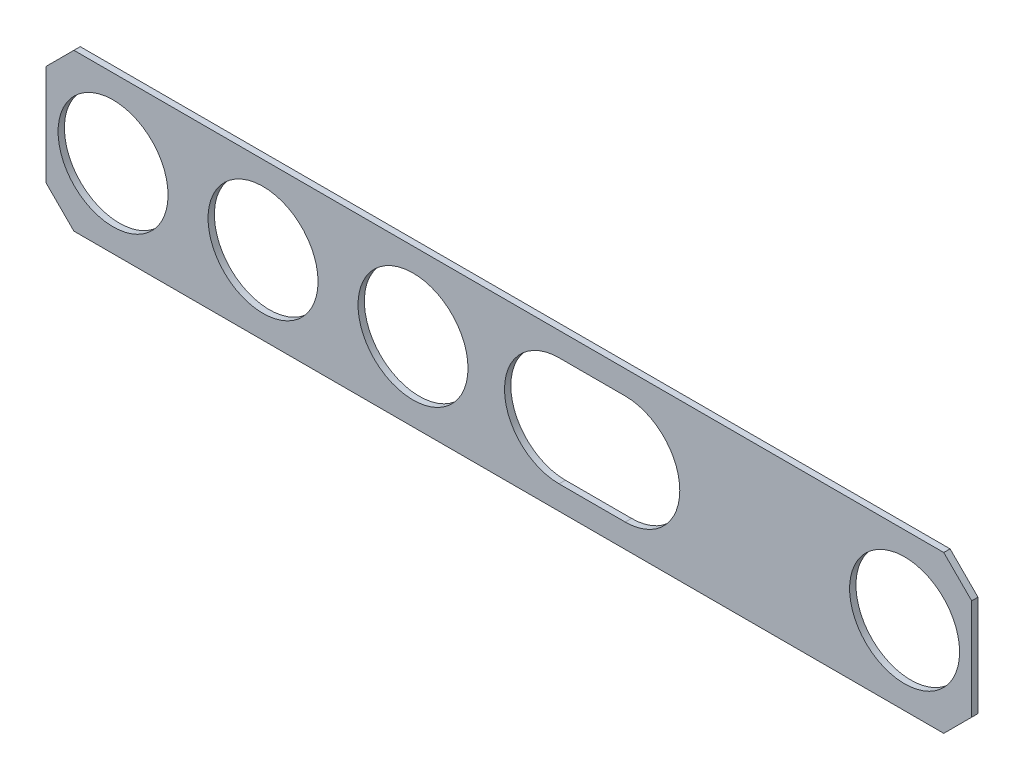
ISO-10303-21;
HEADER;
FILE_DESCRIPTION(('STEP AP214'),'2;1');
FILE_NAME('part.step','',(''),(''),'','','');
FILE_SCHEMA(('AUTOMOTIVE_DESIGN { 1 0 10303 214 1 1 1 1 }'));
ENDSEC;
DATA;
#1=APPLICATION_CONTEXT('core data for automotive mechanical design processes');
#2=APPLICATION_PROTOCOL_DEFINITION('international standard','automotive_design',2000,#1);
#3=PRODUCT_CONTEXT('',#1,'mechanical');
#4=PRODUCT('Part','Part','',(#3));
#5=PRODUCT_RELATED_PRODUCT_CATEGORY('part','',(#4));
#6=PRODUCT_DEFINITION_FORMATION('','',#4);
#7=PRODUCT_DEFINITION_CONTEXT('part definition',#1,'design');
#8=PRODUCT_DEFINITION('design','',#6,#7);
#9=PRODUCT_DEFINITION_SHAPE('','',#8);
#10=(LENGTH_UNIT() NAMED_UNIT(*) SI_UNIT(.MILLI.,.METRE.));
#11=(NAMED_UNIT(*) PLANE_ANGLE_UNIT() SI_UNIT($,.RADIAN.));
#12=(NAMED_UNIT(*) SI_UNIT($,.STERADIAN.) SOLID_ANGLE_UNIT());
#13=UNCERTAINTY_MEASURE_WITH_UNIT(LENGTH_MEASURE(1.E-05),#10,'distance_accuracy_value','');
#14=(GEOMETRIC_REPRESENTATION_CONTEXT(3) GLOBAL_UNCERTAINTY_ASSIGNED_CONTEXT((#13)) GLOBAL_UNIT_ASSIGNED_CONTEXT((#10,
#11,#12)) REPRESENTATION_CONTEXT('',''));
#15=CARTESIAN_POINT('',(0.,0.,0.));
#16=DIRECTION('',(0.,0.,1.));
#17=DIRECTION('',(1.,0.,0.));
#18=AXIS2_PLACEMENT_3D('',#15,#16,#17);
#19=CARTESIAN_POINT('',(0.,0.,-1.835));
#20=DIRECTION('',(0.,0.,1.));
#21=DIRECTION('',(1.,0.,0.));
#22=AXIS2_PLACEMENT_3D('',#19,#20,#21);
#23=PLANE('',#22);
#24=CARTESIAN_POINT('',(13.96785551477,0.,-1.835));
#25=DIRECTION('',(0.,0.,1.));
#26=DIRECTION('',(1.,0.,0.));
#27=AXIS2_PLACEMENT_3D('',#24,#25,#26);
#28=CIRCLE('',#27,6.55);
#29=CARTESIAN_POINT('',(13.96785551477,6.55,-1.835));
#30=VERTEX_POINT('',#29);
#31=CARTESIAN_POINT('',(13.96785551477,-6.55,-1.835));
#32=VERTEX_POINT('',#31);
#33=EDGE_CURVE('E118',#30,#32,#28,.F.);
#34=ORIENTED_EDGE('',*,*,#33,.T.);
#35=DIRECTION('',(1.,0.,0.));
#36=VECTOR('',#35,1.);
#37=CARTESIAN_POINT('',(13.96785551477,-6.55,-1.835));
#38=LINE('',#37,#36);
#39=CARTESIAN_POINT('',(6.032144485231,-6.55,-1.835));
#40=VERTEX_POINT('',#39);
#41=EDGE_CURVE('E120',#40,#32,#38,.T.);
#42=ORIENTED_EDGE('',*,*,#41,.F.);
#43=CARTESIAN_POINT('',(6.032144485231,0.,-1.835));
#44=DIRECTION('',(0.,0.,1.));
#45=DIRECTION('',(1.,0.,0.));
#46=AXIS2_PLACEMENT_3D('',#43,#44,#45);
#47=CIRCLE('',#46,6.55);
#48=CARTESIAN_POINT('',(6.032144485231,6.55,-1.835));
#49=VERTEX_POINT('',#48);
#50=EDGE_CURVE('E56',#40,#49,#47,.F.);
#51=ORIENTED_EDGE('',*,*,#50,.T.);
#52=DIRECTION('',(1.,0.,0.));
#53=VECTOR('',#52,1.);
#54=CARTESIAN_POINT('',(6.032144485231,6.55,-1.835));
#55=LINE('',#54,#53);
#56=EDGE_CURVE('E116',#30,#49,#55,.F.);
#57=ORIENTED_EDGE('',*,*,#56,.F.);
#58=EDGE_LOOP('',(#34,#42,#51,#57));
#59=FACE_BOUND('',#58,.T.);
#60=CARTESIAN_POINT('',(47.5,0.,-1.835));
#61=DIRECTION('',(0.,0.,1.));
#62=DIRECTION('',(1.,0.,0.));
#63=AXIS2_PLACEMENT_3D('',#60,#61,#62);
#64=CIRCLE('',#63,6.6);
#65=CARTESIAN_POINT('',(54.1,0.,-1.835));
#66=VERTEX_POINT('',#65);
#67=EDGE_CURVE('E121',#66,#66,#64,.F.);
#68=ORIENTED_EDGE('',*,*,#67,.T.);
#69=EDGE_LOOP('',(#68));
#70=FACE_BOUND('',#69,.T.);
#71=CARTESIAN_POINT('',(-47.5,0.,-1.835));
#72=DIRECTION('',(0.,0.,1.));
#73=DIRECTION('',(1.,0.,0.));
#74=AXIS2_PLACEMENT_3D('',#71,#72,#73);
#75=CIRCLE('',#74,6.6);
#76=CARTESIAN_POINT('',(-40.9,0.,-1.835));
#77=VERTEX_POINT('',#76);
#78=EDGE_CURVE('E146',#77,#77,#75,.F.);
#79=ORIENTED_EDGE('',*,*,#78,.T.);
#80=EDGE_LOOP('',(#79));
#81=FACE_BOUND('',#80,.T.);
#82=CARTESIAN_POINT('',(-29.5,0.,-1.835));
#83=DIRECTION('',(0.,0.,1.));
#84=DIRECTION('',(1.,0.,0.));
#85=AXIS2_PLACEMENT_3D('',#82,#83,#84);
#86=CIRCLE('',#85,6.6);
#87=CARTESIAN_POINT('',(-22.9,0.,-1.835));
#88=VERTEX_POINT('',#87);
#89=EDGE_CURVE('E148',#88,#88,#86,.F.);
#90=ORIENTED_EDGE('',*,*,#89,.T.);
#91=EDGE_LOOP('',(#90));
#92=FACE_BOUND('',#91,.T.);
#93=CARTESIAN_POINT('',(-11.5,0.,-1.835));
#94=DIRECTION('',(0.,0.,1.));
#95=DIRECTION('',(1.,0.,0.));
#96=AXIS2_PLACEMENT_3D('',#93,#94,#95);
#97=CIRCLE('',#96,6.6);
#98=CARTESIAN_POINT('',(-4.9,0.,-1.835));
#99=VERTEX_POINT('',#98);
#100=EDGE_CURVE('E20',#99,#99,#97,.F.);
#101=ORIENTED_EDGE('',*,*,#100,.T.);
#102=EDGE_LOOP('',(#101));
#103=FACE_BOUND('',#102,.T.);
#104=DIRECTION('',(0.,1.,0.));
#105=VECTOR('',#104,1.);
#106=CARTESIAN_POINT('',(55.55,-6.050050506339,-1.835));
#107=LINE('',#106,#105);
#108=CARTESIAN_POINT('',(55.55,6.050050506339,-1.835));
#109=VERTEX_POINT('',#108);
#110=CARTESIAN_POINT('',(55.55,-6.05005050634,-1.835));
#111=VERTEX_POINT('',#110);
#112=EDGE_CURVE('E97',#109,#111,#107,.F.);
#113=ORIENTED_EDGE('',*,*,#112,.F.);
#114=DIRECTION('',(-0.707106781186548,0.707106781186548,0.));
#115=VECTOR('',#114,1.);
#116=CARTESIAN_POINT('',(55.55,6.050050506339,-1.835));
#117=LINE('',#116,#115);
#118=CARTESIAN_POINT('',(52.2000505063397,9.39999999999975,-1.835));
#119=VERTEX_POINT('',#118);
#120=EDGE_CURVE('E68',#119,#109,#117,.F.);
#121=ORIENTED_EDGE('',*,*,#120,.F.);
#122=DIRECTION('',(1.,0.,0.));
#123=VECTOR('',#122,1.);
#124=CARTESIAN_POINT('',(52.20005050634,9.4,-1.835));
#125=LINE('',#124,#123);
#126=CARTESIAN_POINT('',(-52.20005050634,9.4,-1.835));
#127=VERTEX_POINT('',#126);
#128=EDGE_CURVE('E94',#127,#119,#125,.T.);
#129=ORIENTED_EDGE('',*,*,#128,.F.);
#130=DIRECTION('',(-0.707106781186548,-0.707106781186548,0.));
#131=VECTOR('',#130,1.);
#132=CARTESIAN_POINT('',(-52.20005050634,9.4,-1.835));
#133=LINE('',#132,#131);
#134=CARTESIAN_POINT('',(-55.55,6.05005050634,-1.835));
#135=VERTEX_POINT('',#134);
#136=EDGE_CURVE('E190',#135,#127,#133,.F.);
#137=ORIENTED_EDGE('',*,*,#136,.F.);
#138=DIRECTION('',(0.,1.,0.));
#139=VECTOR('',#138,1.);
#140=CARTESIAN_POINT('',(-55.55,6.050050506339,-1.835));
#141=LINE('',#140,#139);
#142=CARTESIAN_POINT('',(-55.55,-6.050050506339,-1.835));
#143=VERTEX_POINT('',#142);
#144=EDGE_CURVE('E184',#143,#135,#141,.T.);
#145=ORIENTED_EDGE('',*,*,#144,.F.);
#146=DIRECTION('',(0.707106781186548,-0.707106781186548,0.));
#147=VECTOR('',#146,1.);
#148=CARTESIAN_POINT('',(-55.55,-6.050050506339,-1.835));
#149=LINE('',#148,#147);
#150=CARTESIAN_POINT('',(-52.2000505063397,-9.39999999999975,-1.835));
#151=VERTEX_POINT('',#150);
#152=EDGE_CURVE('E178',#151,#143,#149,.F.);
#153=ORIENTED_EDGE('',*,*,#152,.F.);
#154=DIRECTION('',(1.,0.,0.));
#155=VECTOR('',#154,1.);
#156=CARTESIAN_POINT('',(-52.20005050634,-9.4,-1.835));
#157=LINE('',#156,#155);
#158=CARTESIAN_POINT('',(52.20005050634,-9.4,-1.835));
#159=VERTEX_POINT('',#158);
#160=EDGE_CURVE('E172',#159,#151,#157,.F.);
#161=ORIENTED_EDGE('',*,*,#160,.F.);
#162=DIRECTION('',(0.707106781186548,0.707106781186548,0.));
#163=VECTOR('',#162,1.);
#164=CARTESIAN_POINT('',(52.20005050634,-9.4,-1.835));
#165=LINE('',#164,#163);
#166=EDGE_CURVE('E166',#111,#159,#165,.F.);
#167=ORIENTED_EDGE('',*,*,#166,.F.);
#168=EDGE_LOOP('',(#113,#121,#129,#137,#145,#153,#161,#167));
#169=FACE_BOUND('',#168,.T.);
#170=ADVANCED_FACE('F17',(#59,#70,#81,#92,#103,#169),#23,.T.);
#171=CARTESIAN_POINT('',(55.55,6.050050506339,-1.835));
#172=DIRECTION('',(0.707106781186548,0.707106781186548,0.));
#173=DIRECTION('',(-0.707106781186548,0.707106781186548,0.));
#174=AXIS2_PLACEMENT_3D('',#171,#172,#173);
#175=PLANE('',#174);
#176=DIRECTION('',(0.,0.,1.));
#177=VECTOR('',#176,1.);
#178=CARTESIAN_POINT('',(52.20005050634,9.4,-1.835));
#179=LINE('',#178,#177);
#180=CARTESIAN_POINT('',(52.2000505063397,9.39999999999975,-2.595));
#181=VERTEX_POINT('',#180);
#182=EDGE_CURVE('E98',#119,#181,#179,.F.);
#183=ORIENTED_EDGE('',*,*,#182,.F.);
#184=ORIENTED_EDGE('',*,*,#120,.T.);
#185=DIRECTION('',(0.,0.,-1.));
#186=VECTOR('',#185,1.);
#187=CARTESIAN_POINT('',(55.55,6.050050506339,-1.835));
#188=LINE('',#187,#186);
#189=CARTESIAN_POINT('',(55.55,6.050050506339,-2.595));
#190=VERTEX_POINT('',#189);
#191=EDGE_CURVE('E155',#190,#109,#188,.F.);
#192=ORIENTED_EDGE('',*,*,#191,.F.);
#193=DIRECTION('',(-0.707106781186441,0.707106781186654,0.));
#194=VECTOR('',#193,1.);
#195=CARTESIAN_POINT('',(55.55,6.050050506339,-2.595));
#196=LINE('',#195,#194);
#197=EDGE_CURVE('E112',#190,#181,#196,.T.);
#198=ORIENTED_EDGE('',*,*,#197,.T.);
#199=EDGE_LOOP('',(#183,#184,#192,#198));
#200=FACE_BOUND('',#199,.T.);
#201=ADVANCED_FACE('F110',(#200),#175,.T.);
#202=CARTESIAN_POINT('',(52.20005050634,9.4,-1.835));
#203=DIRECTION('',(0.,1.,0.));
#204=DIRECTION('',(0.,0.,1.));
#205=AXIS2_PLACEMENT_3D('',#202,#203,#204);
#206=PLANE('',#205);
#207=DIRECTION('',(0.,0.,1.));
#208=VECTOR('',#207,1.);
#209=CARTESIAN_POINT('',(-52.20005050634,9.4,-1.835));
#210=LINE('',#209,#208);
#211=CARTESIAN_POINT('',(-52.20005050634,9.4,-2.595));
#212=VERTEX_POINT('',#211);
#213=EDGE_CURVE('E107',#127,#212,#210,.F.);
#214=ORIENTED_EDGE('',*,*,#213,.F.);
#215=ORIENTED_EDGE('',*,*,#128,.T.);
#216=ORIENTED_EDGE('',*,*,#182,.T.);
#217=DIRECTION('',(1.,0.,0.));
#218=VECTOR('',#217,1.);
#219=CARTESIAN_POINT('',(0.,9.4,-2.595));
#220=LINE('',#219,#218);
#221=EDGE_CURVE('E204',#181,#212,#220,.F.);
#222=ORIENTED_EDGE('',*,*,#221,.T.);
#223=EDGE_LOOP('',(#214,#215,#216,#222));
#224=FACE_BOUND('',#223,.T.);
#225=ADVANCED_FACE('F103',(#224),#206,.T.);
#226=CARTESIAN_POINT('',(-52.20005050634,9.4,-1.835));
#227=DIRECTION('',(-0.707106781186548,0.707106781186548,0.));
#228=DIRECTION('',(-0.707106781186548,-0.707106781186548,0.));
#229=AXIS2_PLACEMENT_3D('',#226,#227,#228);
#230=PLANE('',#229);
#231=DIRECTION('',(0.,0.,1.));
#232=VECTOR('',#231,1.);
#233=CARTESIAN_POINT('',(-55.55,6.05005050634,-1.835));
#234=LINE('',#233,#232);
#235=CARTESIAN_POINT('',(-55.55,6.05005050634,-2.595));
#236=VERTEX_POINT('',#235);
#237=EDGE_CURVE('E187',#135,#236,#234,.F.);
#238=ORIENTED_EDGE('',*,*,#237,.F.);
#239=ORIENTED_EDGE('',*,*,#136,.T.);
#240=ORIENTED_EDGE('',*,*,#213,.T.);
#241=DIRECTION('',(-0.707106781186547,-0.707106781186548,0.));
#242=VECTOR('',#241,1.);
#243=CARTESIAN_POINT('',(-52.20005050634,9.4,-2.595));
#244=LINE('',#243,#242);
#245=EDGE_CURVE('E198',#212,#236,#244,.T.);
#246=ORIENTED_EDGE('',*,*,#245,.T.);
#247=EDGE_LOOP('',(#238,#239,#240,#246));
#248=FACE_BOUND('',#247,.T.);
#249=ADVANCED_FACE('F196',(#248),#230,.T.);
#250=CARTESIAN_POINT('',(-55.55,6.050050506339,-1.835));
#251=DIRECTION('',(-1.,0.,0.));
#252=DIRECTION('',(0.,0.,1.));
#253=AXIS2_PLACEMENT_3D('',#250,#251,#252);
#254=PLANE('',#253);
#255=DIRECTION('',(0.,0.,1.));
#256=VECTOR('',#255,1.);
#257=CARTESIAN_POINT('',(-55.55,-6.050050506339,-1.835));
#258=LINE('',#257,#256);
#259=CARTESIAN_POINT('',(-55.55,-6.050050506339,-2.595));
#260=VERTEX_POINT('',#259);
#261=EDGE_CURVE('E181',#143,#260,#258,.F.);
#262=ORIENTED_EDGE('',*,*,#261,.F.);
#263=ORIENTED_EDGE('',*,*,#144,.T.);
#264=ORIENTED_EDGE('',*,*,#237,.T.);
#265=DIRECTION('',(0.,1.,0.));
#266=VECTOR('',#265,1.);
#267=CARTESIAN_POINT('',(-55.55,0.,-2.595));
#268=LINE('',#267,#266);
#269=EDGE_CURVE('E207',#236,#260,#268,.F.);
#270=ORIENTED_EDGE('',*,*,#269,.T.);
#271=EDGE_LOOP('',(#262,#263,#264,#270));
#272=FACE_BOUND('',#271,.T.);
#273=ADVANCED_FACE('F245',(#272),#254,.T.);
#274=CARTESIAN_POINT('',(-55.55,-6.050050506339,-1.835));
#275=DIRECTION('',(-0.707106781186548,-0.707106781186548,0.));
#276=DIRECTION('',(0.707106781186548,-0.707106781186548,0.));
#277=AXIS2_PLACEMENT_3D('',#274,#275,#276);
#278=PLANE('',#277);
#279=DIRECTION('',(0.,0.,-1.));
#280=VECTOR('',#279,1.);
#281=CARTESIAN_POINT('',(-52.20005050634,-9.4,-1.835));
#282=LINE('',#281,#280);
#283=CARTESIAN_POINT('',(-52.2000505063397,-9.39999999999975,-2.595));
#284=VERTEX_POINT('',#283);
#285=EDGE_CURVE('E175',#151,#284,#282,.T.);
#286=ORIENTED_EDGE('',*,*,#285,.F.);
#287=ORIENTED_EDGE('',*,*,#152,.T.);
#288=ORIENTED_EDGE('',*,*,#261,.T.);
#289=DIRECTION('',(0.707106781186441,-0.707106781186654,0.));
#290=VECTOR('',#289,1.);
#291=CARTESIAN_POINT('',(-55.55,-6.050050506339,-2.595));
#292=LINE('',#291,#290);
#293=EDGE_CURVE('E240',#260,#284,#292,.T.);
#294=ORIENTED_EDGE('',*,*,#293,.T.);
#295=EDGE_LOOP('',(#286,#287,#288,#294));
#296=FACE_BOUND('',#295,.T.);
#297=ADVANCED_FACE('F264',(#296),#278,.T.);
#298=CARTESIAN_POINT('',(-52.20005050634,-9.4,-1.835));
#299=DIRECTION('',(0.,-1.,0.));
#300=DIRECTION('',(0.,0.,-1.));
#301=AXIS2_PLACEMENT_3D('',#298,#299,#300);
#302=PLANE('',#301);
#303=DIRECTION('',(0.,0.,1.));
#304=VECTOR('',#303,1.);
#305=CARTESIAN_POINT('',(52.20005050634,-9.4,-1.835));
#306=LINE('',#305,#304);
#307=CARTESIAN_POINT('',(52.20005050634,-9.4,-2.595));
#308=VERTEX_POINT('',#307);
#309=EDGE_CURVE('E169',#159,#308,#306,.F.);
#310=ORIENTED_EDGE('',*,*,#309,.F.);
#311=ORIENTED_EDGE('',*,*,#160,.T.);
#312=ORIENTED_EDGE('',*,*,#285,.T.);
#313=DIRECTION('',(1.,0.,0.));
#314=VECTOR('',#313,1.);
#315=CARTESIAN_POINT('',(0.,-9.4,-2.595));
#316=LINE('',#315,#314);
#317=EDGE_CURVE('E237',#284,#308,#316,.T.);
#318=ORIENTED_EDGE('',*,*,#317,.T.);
#319=EDGE_LOOP('',(#310,#311,#312,#318));
#320=FACE_BOUND('',#319,.T.);
#321=ADVANCED_FACE('F262',(#320),#302,.T.);
#322=CARTESIAN_POINT('',(52.20005050634,-9.4,-1.835));
#323=DIRECTION('',(0.707106781186548,-0.707106781186548,0.));
#324=DIRECTION('',(0.707106781186548,0.707106781186548,0.));
#325=AXIS2_PLACEMENT_3D('',#322,#323,#324);
#326=PLANE('',#325);
#327=DIRECTION('',(0.,0.,-1.));
#328=VECTOR('',#327,1.);
#329=CARTESIAN_POINT('',(55.55,-6.05005050634,-1.835));
#330=LINE('',#329,#328);
#331=CARTESIAN_POINT('',(55.55,-6.05005050634,-2.595));
#332=VERTEX_POINT('',#331);
#333=EDGE_CURVE('E160',#111,#332,#330,.T.);
#334=ORIENTED_EDGE('',*,*,#333,.F.);
#335=ORIENTED_EDGE('',*,*,#166,.T.);
#336=ORIENTED_EDGE('',*,*,#309,.T.);
#337=DIRECTION('',(0.707106781186547,0.707106781186548,0.));
#338=VECTOR('',#337,1.);
#339=CARTESIAN_POINT('',(52.20005050634,-9.4,-2.595));
#340=LINE('',#339,#338);
#341=EDGE_CURVE('E234',#308,#332,#340,.T.);
#342=ORIENTED_EDGE('',*,*,#341,.T.);
#343=EDGE_LOOP('',(#334,#335,#336,#342));
#344=FACE_BOUND('',#343,.T.);
#345=ADVANCED_FACE('F258',(#344),#326,.T.);
#346=CARTESIAN_POINT('',(55.55,-6.050050506339,-1.835));
#347=DIRECTION('',(1.,0.,0.));
#348=DIRECTION('',(0.,0.,-1.));
#349=AXIS2_PLACEMENT_3D('',#346,#347,#348);
#350=PLANE('',#349);
#351=ORIENTED_EDGE('',*,*,#191,.T.);
#352=ORIENTED_EDGE('',*,*,#112,.T.);
#353=ORIENTED_EDGE('',*,*,#333,.T.);
#354=DIRECTION('',(0.,1.,0.));
#355=VECTOR('',#354,1.);
#356=CARTESIAN_POINT('',(55.55,0.,-2.595));
#357=LINE('',#356,#355);
#358=EDGE_CURVE('E138',#332,#190,#357,.T.);
#359=ORIENTED_EDGE('',*,*,#358,.T.);
#360=EDGE_LOOP('',(#351,#352,#353,#359));
#361=FACE_BOUND('',#360,.T.);
#362=ADVANCED_FACE('F255',(#361),#350,.T.);
#363=CARTESIAN_POINT('',(-11.5,0.,-1.835));
#364=DIRECTION('',(0.,0.,1.));
#365=DIRECTION('',(1.,0.,0.));
#366=AXIS2_PLACEMENT_3D('',#363,#364,#365);
#367=CYLINDRICAL_SURFACE('',#366,6.6);
#368=CARTESIAN_POINT('',(-11.5,0.,-2.595));
#369=DIRECTION('',(0.,0.,1.));
#370=DIRECTION('',(1.,0.,0.));
#371=AXIS2_PLACEMENT_3D('',#368,#369,#370);
#372=CIRCLE('',#371,6.6);
#373=CARTESIAN_POINT('',(-4.9,0.,-2.595));
#374=VERTEX_POINT('',#373);
#375=EDGE_CURVE('E135',#374,#374,#372,.F.);
#376=ORIENTED_EDGE('',*,*,#375,.T.);
#377=EDGE_LOOP('',(#376));
#378=FACE_BOUND('',#377,.T.);
#379=ORIENTED_EDGE('',*,*,#100,.F.);
#380=EDGE_LOOP('',(#379));
#381=FACE_BOUND('',#380,.T.);
#382=ADVANCED_FACE('F300',(#378,#381),#367,.F.);
#383=CARTESIAN_POINT('',(-29.5,0.,-1.835));
#384=DIRECTION('',(0.,0.,1.));
#385=DIRECTION('',(1.,0.,0.));
#386=AXIS2_PLACEMENT_3D('',#383,#384,#385);
#387=CYLINDRICAL_SURFACE('',#386,6.6);
#388=CARTESIAN_POINT('',(-29.5,0.,-2.595));
#389=DIRECTION('',(0.,0.,1.));
#390=DIRECTION('',(1.,0.,0.));
#391=AXIS2_PLACEMENT_3D('',#388,#389,#390);
#392=CIRCLE('',#391,6.6);
#393=CARTESIAN_POINT('',(-22.9,0.,-2.595));
#394=VERTEX_POINT('',#393);
#395=EDGE_CURVE('E132',#394,#394,#392,.F.);
#396=ORIENTED_EDGE('',*,*,#395,.T.);
#397=EDGE_LOOP('',(#396));
#398=FACE_BOUND('',#397,.T.);
#399=ORIENTED_EDGE('',*,*,#89,.F.);
#400=EDGE_LOOP('',(#399));
#401=FACE_BOUND('',#400,.T.);
#402=ADVANCED_FACE('F296',(#398,#401),#387,.F.);
#403=CARTESIAN_POINT('',(-47.5,0.,-1.835));
#404=DIRECTION('',(0.,0.,1.));
#405=DIRECTION('',(1.,0.,0.));
#406=AXIS2_PLACEMENT_3D('',#403,#404,#405);
#407=CYLINDRICAL_SURFACE('',#406,6.6);
#408=CARTESIAN_POINT('',(-47.5,0.,-2.595));
#409=DIRECTION('',(0.,0.,1.));
#410=DIRECTION('',(1.,0.,0.));
#411=AXIS2_PLACEMENT_3D('',#408,#409,#410);
#412=CIRCLE('',#411,6.6);
#413=CARTESIAN_POINT('',(-40.9,0.,-2.595));
#414=VERTEX_POINT('',#413);
#415=EDGE_CURVE('E129',#414,#414,#412,.F.);
#416=ORIENTED_EDGE('',*,*,#415,.T.);
#417=EDGE_LOOP('',(#416));
#418=FACE_BOUND('',#417,.T.);
#419=ORIENTED_EDGE('',*,*,#78,.F.);
#420=EDGE_LOOP('',(#419));
#421=FACE_BOUND('',#420,.T.);
#422=ADVANCED_FACE('F292',(#418,#421),#407,.F.);
#423=CARTESIAN_POINT('',(47.5,0.,-1.835));
#424=DIRECTION('',(0.,0.,1.));
#425=DIRECTION('',(1.,0.,0.));
#426=AXIS2_PLACEMENT_3D('',#423,#424,#425);
#427=CYLINDRICAL_SURFACE('',#426,6.6);
#428=CARTESIAN_POINT('',(47.5,0.,-2.595));
#429=DIRECTION('',(0.,0.,1.));
#430=DIRECTION('',(1.,0.,0.));
#431=AXIS2_PLACEMENT_3D('',#428,#429,#430);
#432=CIRCLE('',#431,6.6);
#433=CARTESIAN_POINT('',(54.1,0.,-2.595));
#434=VERTEX_POINT('',#433);
#435=EDGE_CURVE('E126',#434,#434,#432,.F.);
#436=ORIENTED_EDGE('',*,*,#435,.T.);
#437=EDGE_LOOP('',(#436));
#438=FACE_BOUND('',#437,.T.);
#439=ORIENTED_EDGE('',*,*,#67,.F.);
#440=EDGE_LOOP('',(#439));
#441=FACE_BOUND('',#440,.T.);
#442=ADVANCED_FACE('F289',(#438,#441),#427,.F.);
#443=CARTESIAN_POINT('',(13.96785551477,-6.55,-1.835));
#444=DIRECTION('',(0.,1.,0.));
#445=DIRECTION('',(0.,0.,1.));
#446=AXIS2_PLACEMENT_3D('',#443,#444,#445);
#447=PLANE('',#446);
#448=DIRECTION('',(0.,0.,1.));
#449=VECTOR('',#448,1.);
#450=CARTESIAN_POINT('',(6.032144485231,-6.55,-1.835));
#451=LINE('',#450,#449);
#452=CARTESIAN_POINT('',(6.032144485231,-6.55,-2.595));
#453=VERTEX_POINT('',#452);
#454=EDGE_CURVE('E143',#453,#40,#451,.T.);
#455=ORIENTED_EDGE('',*,*,#454,.T.);
#456=ORIENTED_EDGE('',*,*,#41,.T.);
#457=DIRECTION('',(0.,0.,1.));
#458=VECTOR('',#457,1.);
#459=CARTESIAN_POINT('',(13.96785551477,-6.55,-1.835));
#460=LINE('',#459,#458);
#461=CARTESIAN_POINT('',(13.96785551477,-6.55,-2.595));
#462=VERTEX_POINT('',#461);
#463=EDGE_CURVE('E141',#32,#462,#460,.F.);
#464=ORIENTED_EDGE('',*,*,#463,.T.);
#465=DIRECTION('',(1.,0.,0.));
#466=VECTOR('',#465,1.);
#467=CARTESIAN_POINT('',(0.,-6.55,-2.595));
#468=LINE('',#467,#466);
#469=EDGE_CURVE('E125',#462,#453,#468,.F.);
#470=ORIENTED_EDGE('',*,*,#469,.T.);
#471=EDGE_LOOP('',(#455,#456,#464,#470));
#472=FACE_BOUND('',#471,.T.);
#473=ADVANCED_FACE('F222',(#472),#447,.T.);
#474=CARTESIAN_POINT('',(6.032144485231,0.,-1.835));
#475=DIRECTION('',(0.,0.,1.));
#476=DIRECTION('',(1.,0.,0.));
#477=AXIS2_PLACEMENT_3D('',#474,#475,#476);
#478=CYLINDRICAL_SURFACE('',#477,6.55);
#479=CARTESIAN_POINT('',(6.032144485231,0.,-2.595));
#480=DIRECTION('',(0.,0.,1.));
#481=DIRECTION('',(1.,0.,0.));
#482=AXIS2_PLACEMENT_3D('',#479,#480,#481);
#483=CIRCLE('',#482,6.55);
#484=CARTESIAN_POINT('',(6.032144485231,6.55,-2.595));
#485=VERTEX_POINT('',#484);
#486=EDGE_CURVE('E123',#453,#485,#483,.F.);
#487=ORIENTED_EDGE('',*,*,#486,.T.);
#488=DIRECTION('',(0.,0.,-1.));
#489=VECTOR('',#488,1.);
#490=CARTESIAN_POINT('',(6.032144485231,6.55,-1.835));
#491=LINE('',#490,#489);
#492=EDGE_CURVE('E119',#49,#485,#491,.T.);
#493=ORIENTED_EDGE('',*,*,#492,.F.);
#494=ORIENTED_EDGE('',*,*,#50,.F.);
#495=ORIENTED_EDGE('',*,*,#454,.F.);
#496=EDGE_LOOP('',(#487,#493,#494,#495));
#497=FACE_BOUND('',#496,.T.);
#498=ADVANCED_FACE('F226',(#497),#478,.F.);
#499=CARTESIAN_POINT('',(6.032144485231,6.55,-1.835));
#500=DIRECTION('',(0.,-1.,0.));
#501=DIRECTION('',(0.,0.,-1.));
#502=AXIS2_PLACEMENT_3D('',#499,#500,#501);
#503=PLANE('',#502);
#504=DIRECTION('',(0.,0.,1.));
#505=VECTOR('',#504,1.);
#506=CARTESIAN_POINT('',(13.96785551477,6.55,-1.835));
#507=LINE('',#506,#505);
#508=CARTESIAN_POINT('',(13.96785551477,6.55,-2.595));
#509=VERTEX_POINT('',#508);
#510=EDGE_CURVE('E34',#509,#30,#507,.T.);
#511=ORIENTED_EDGE('',*,*,#510,.T.);
#512=ORIENTED_EDGE('',*,*,#56,.T.);
#513=ORIENTED_EDGE('',*,*,#492,.T.);
#514=DIRECTION('',(1.,0.,0.));
#515=VECTOR('',#514,1.);
#516=CARTESIAN_POINT('',(0.,6.55,-2.595));
#517=LINE('',#516,#515);
#518=EDGE_CURVE('E26',#485,#509,#517,.T.);
#519=ORIENTED_EDGE('',*,*,#518,.T.);
#520=EDGE_LOOP('',(#511,#512,#513,#519));
#521=FACE_BOUND('',#520,.T.);
#522=ADVANCED_FACE('F280',(#521),#503,.T.);
#523=CARTESIAN_POINT('',(13.96785551477,0.,-1.835));
#524=DIRECTION('',(0.,0.,1.));
#525=DIRECTION('',(1.,0.,0.));
#526=AXIS2_PLACEMENT_3D('',#523,#524,#525);
#527=CYLINDRICAL_SURFACE('',#526,6.55);
#528=CARTESIAN_POINT('',(13.96785551477,0.,-2.595));
#529=DIRECTION('',(0.,0.,1.));
#530=DIRECTION('',(1.,0.,0.));
#531=AXIS2_PLACEMENT_3D('',#528,#529,#530);
#532=CIRCLE('',#531,6.55);
#533=EDGE_CURVE('E11',#509,#462,#532,.F.);
#534=ORIENTED_EDGE('',*,*,#533,.T.);
#535=ORIENTED_EDGE('',*,*,#463,.F.);
#536=ORIENTED_EDGE('',*,*,#33,.F.);
#537=ORIENTED_EDGE('',*,*,#510,.F.);
#538=EDGE_LOOP('',(#534,#535,#536,#537));
#539=FACE_BOUND('',#538,.T.);
#540=ADVANCED_FACE('F275',(#539),#527,.F.);
#541=CARTESIAN_POINT('',(0.,0.,-2.595));
#542=DIRECTION('',(0.,0.,1.));
#543=DIRECTION('',(1.,0.,0.));
#544=AXIS2_PLACEMENT_3D('',#541,#542,#543);
#545=PLANE('',#544);
#546=ORIENTED_EDGE('',*,*,#533,.F.);
#547=ORIENTED_EDGE('',*,*,#518,.F.);
#548=ORIENTED_EDGE('',*,*,#486,.F.);
#549=ORIENTED_EDGE('',*,*,#469,.F.);
#550=EDGE_LOOP('',(#546,#547,#548,#549));
#551=FACE_BOUND('',#550,.T.);
#552=ORIENTED_EDGE('',*,*,#435,.F.);
#553=EDGE_LOOP('',(#552));
#554=FACE_BOUND('',#553,.T.);
#555=ORIENTED_EDGE('',*,*,#415,.F.);
#556=EDGE_LOOP('',(#555));
#557=FACE_BOUND('',#556,.T.);
#558=ORIENTED_EDGE('',*,*,#395,.F.);
#559=EDGE_LOOP('',(#558));
#560=FACE_BOUND('',#559,.T.);
#561=ORIENTED_EDGE('',*,*,#375,.F.);
#562=EDGE_LOOP('',(#561));
#563=FACE_BOUND('',#562,.T.);
#564=ORIENTED_EDGE('',*,*,#341,.F.);
#565=ORIENTED_EDGE('',*,*,#317,.F.);
#566=ORIENTED_EDGE('',*,*,#293,.F.);
#567=ORIENTED_EDGE('',*,*,#269,.F.);
#568=ORIENTED_EDGE('',*,*,#245,.F.);
#569=ORIENTED_EDGE('',*,*,#221,.F.);
#570=ORIENTED_EDGE('',*,*,#197,.F.);
#571=ORIENTED_EDGE('',*,*,#358,.F.);
#572=EDGE_LOOP('',(#564,#565,#566,#567,#568,#569,#570,#571));
#573=FACE_BOUND('',#572,.T.);
#574=ADVANCED_FACE('F203',(#551,#554,#557,#560,#563,#573),#545,.F.);
#575=CLOSED_SHELL('',(#170,#201,#225,#249,#273,#297,#321,#345,#362,#382,#402,#422,#442,#473,
#498,#522,#540,#574));
#576=MANIFOLD_SOLID_BREP('B1',#575);
#577=ADVANCED_BREP_SHAPE_REPRESENTATION('',(#18,#576),#14);
#578=SHAPE_DEFINITION_REPRESENTATION(#9,#577);
ENDSEC;
END-ISO-10303-21;
